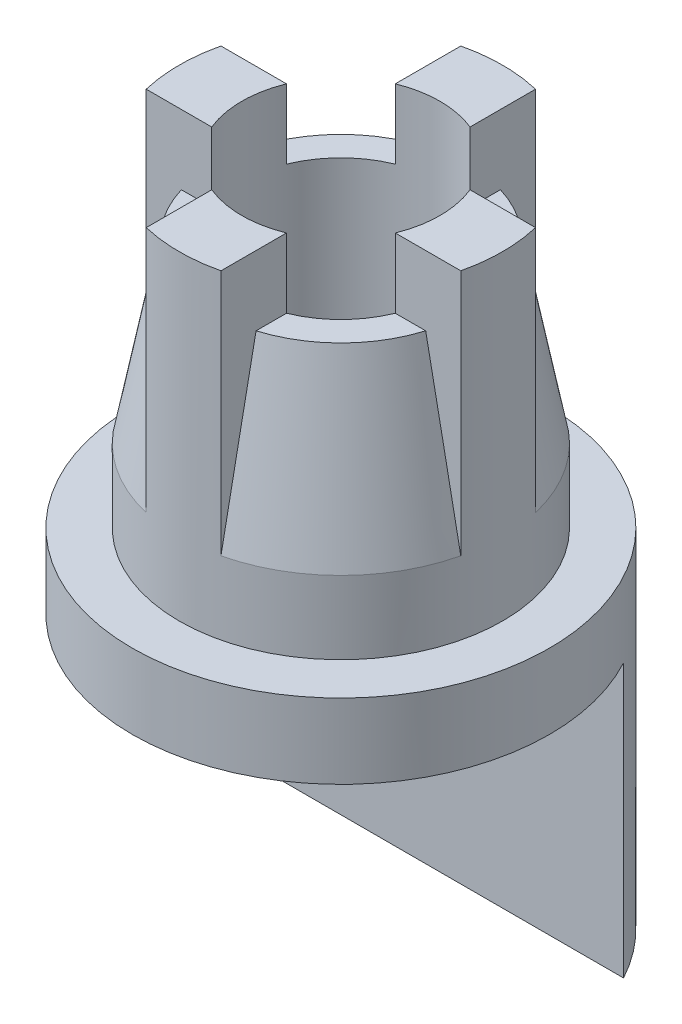
ISO-10303-21;
HEADER;
FILE_DESCRIPTION(('STEP AP214'),'2;1');
FILE_NAME('part.step','',(''),(''),'','','');
FILE_SCHEMA(('AUTOMOTIVE_DESIGN { 1 0 10303 214 1 1 1 1 }'));
ENDSEC;
DATA;
#1=APPLICATION_CONTEXT('core data for automotive mechanical design processes');
#2=APPLICATION_PROTOCOL_DEFINITION('international standard','automotive_design',2000,#1);
#3=PRODUCT_CONTEXT('',#1,'mechanical');
#4=PRODUCT('Part','Part','',(#3));
#5=PRODUCT_RELATED_PRODUCT_CATEGORY('part','',(#4));
#6=PRODUCT_DEFINITION_FORMATION('','',#4);
#7=PRODUCT_DEFINITION_CONTEXT('part definition',#1,'design');
#8=PRODUCT_DEFINITION('design','',#6,#7);
#9=PRODUCT_DEFINITION_SHAPE('','',#8);
#10=(LENGTH_UNIT() NAMED_UNIT(*) SI_UNIT(.MILLI.,.METRE.));
#11=(NAMED_UNIT(*) PLANE_ANGLE_UNIT() SI_UNIT($,.RADIAN.));
#12=(NAMED_UNIT(*) SI_UNIT($,.STERADIAN.) SOLID_ANGLE_UNIT());
#13=UNCERTAINTY_MEASURE_WITH_UNIT(LENGTH_MEASURE(1.E-05),#10,'distance_accuracy_value','');
#14=(GEOMETRIC_REPRESENTATION_CONTEXT(3) GLOBAL_UNCERTAINTY_ASSIGNED_CONTEXT((#13)) GLOBAL_UNIT_ASSIGNED_CONTEXT((#10,
#11,#12)) REPRESENTATION_CONTEXT('',''));
#15=CARTESIAN_POINT('',(0.,0.,0.));
#16=DIRECTION('',(0.,0.,1.));
#17=DIRECTION('',(1.,0.,0.));
#18=AXIS2_PLACEMENT_3D('',#15,#16,#17);
#19=CARTESIAN_POINT('',(0.,9.35,0.));
#20=DIRECTION('',(0.,1.,0.));
#21=DIRECTION('',(0.,0.,1.));
#22=AXIS2_PLACEMENT_3D('',#19,#20,#21);
#23=PLANE('',#22);
#24=CARTESIAN_POINT('',(0.,9.35,0.));
#25=DIRECTION('',(0.,1.,0.));
#26=DIRECTION('',(0.,0.,1.));
#27=AXIS2_PLACEMENT_3D('',#24,#25,#26);
#28=CIRCLE('',#27,2.85);
#29=CARTESIAN_POINT('',(-2.63948385105876,9.35,1.075));
#30=VERTEX_POINT('',#29);
#31=CARTESIAN_POINT('',(-1.075,9.35,2.63948385105876));
#32=VERTEX_POINT('',#31);
#33=EDGE_CURVE('E375',#30,#32,#28,.T.);
#34=ORIENTED_EDGE('',*,*,#33,.F.);
#35=DIRECTION('',(-1.,0.,0.));
#36=VECTOR('',#35,1.);
#37=CARTESIAN_POINT('',(0.,9.35,1.075));
#38=LINE('',#37,#36);
#39=CARTESIAN_POINT('',(-3.51425667816112,9.35,1.075));
#40=VERTEX_POINT('',#39);
#41=EDGE_CURVE('E587',#30,#40,#38,.T.);
#42=ORIENTED_EDGE('',*,*,#41,.T.);
#43=CARTESIAN_POINT('',(0.,9.35,0.));
#44=DIRECTION('',(0.,1.,0.));
#45=DIRECTION('',(0.,0.,1.));
#46=AXIS2_PLACEMENT_3D('',#43,#44,#45);
#47=CIRCLE('',#46,3.67500000000001);
#48=CARTESIAN_POINT('',(-1.075,9.35,3.51425667816112));
#49=VERTEX_POINT('',#48);
#50=EDGE_CURVE('E77',#40,#49,#47,.T.);
#51=ORIENTED_EDGE('',*,*,#50,.T.);
#52=DIRECTION('',(0.,0.,-1.));
#53=VECTOR('',#52,1.);
#54=CARTESIAN_POINT('',(-1.075,9.35,0.));
#55=LINE('',#54,#53);
#56=EDGE_CURVE('E275',#49,#32,#55,.T.);
#57=ORIENTED_EDGE('',*,*,#56,.T.);
#58=EDGE_LOOP('',(#34,#42,#51,#57));
#59=FACE_BOUND('',#58,.T.);
#60=ADVANCED_FACE('F46',(#59),#23,.T.);
#61=CARTESIAN_POINT('',(-1.075,9.35,-3.51425667816112));
#62=VERTEX_POINT('',#61);
#63=CARTESIAN_POINT('',(-3.51425667816112,9.35,-1.075));
#64=VERTEX_POINT('',#63);
#65=EDGE_CURVE('E354',#62,#64,#47,.T.);
#66=ORIENTED_EDGE('',*,*,#65,.T.);
#67=DIRECTION('',(1.,0.,0.));
#68=VECTOR('',#67,1.);
#69=CARTESIAN_POINT('',(0.,9.35,-1.075));
#70=LINE('',#69,#68);
#71=CARTESIAN_POINT('',(-2.63948385105876,9.35,-1.075));
#72=VERTEX_POINT('',#71);
#73=EDGE_CURVE('E69',#64,#72,#70,.T.);
#74=ORIENTED_EDGE('',*,*,#73,.T.);
#75=CARTESIAN_POINT('',(-1.075,9.35,-2.63948385105876));
#76=VERTEX_POINT('',#75);
#77=EDGE_CURVE('E364',#76,#72,#28,.T.);
#78=ORIENTED_EDGE('',*,*,#77,.F.);
#79=DIRECTION('',(0.,0.,-1.));
#80=VECTOR('',#79,1.);
#81=CARTESIAN_POINT('',(-1.075,9.35,0.));
#82=LINE('',#81,#80);
#83=EDGE_CURVE('E401',#76,#62,#82,.T.);
#84=ORIENTED_EDGE('',*,*,#83,.T.);
#85=EDGE_LOOP('',(#66,#74,#78,#84));
#86=FACE_BOUND('',#85,.T.);
#87=ADVANCED_FACE('F482',(#86),#23,.T.);
#88=CARTESIAN_POINT('',(0.,9.35,0.));
#89=DIRECTION('',(0.,-1.,0.));
#90=DIRECTION('',(0.,0.,-1.));
#91=AXIS2_PLACEMENT_3D('',#88,#89,#90);
#92=CONICAL_SURFACE('',#91,3.67500000000001,0.188897180877619);
#93=ORIENTED_EDGE('',*,*,#50,.F.);
#94=CARTESIAN_POINT('',(-2.40631870289933,14.7872511922928,1.075));
#95=CARTESIAN_POINT('',(-2.48209737417026,14.4252786578981,1.075));
#96=CARTESIAN_POINT('',(-2.55733243702377,14.0631929565488,1.075));
#97=CARTESIAN_POINT('',(-2.70692171139468,13.3388404007968,1.075));
#98=CARTESIAN_POINT('',(-2.78127592487787,12.9765735468001,1.075));
#99=CARTESIAN_POINT('',(-3.00332626033005,11.8895718934245,1.075));
#100=CARTESIAN_POINT('',(-3.15001117790777,11.1646307152761,1.075));
#101=CARTESIAN_POINT('',(-3.49050671102614,9.47137304827682,1.075));
#102=CARTESIAN_POINT('',(-3.68363485391252,8.50291962230982,1.075));
#103=CARTESIAN_POINT('',(-4.06797267762404,6.56563143798538,1.075));
#104=CARTESIAN_POINT('',(-4.25918235580213,5.59679667910371,1.075));
#105=CARTESIAN_POINT('',(-4.64033193204531,3.65885685019328,1.075));
#106=CARTESIAN_POINT('',(-4.83027180378933,2.68975177499239,1.075));
#107=CARTESIAN_POINT('',(-5.20923267535355,0.751365541388782,1.075));
#108=CARTESIAN_POINT('',(-5.39825367847481,-0.217915616368351,1.075));
#109=CARTESIAN_POINT('',(-5.58699337769868,-1.18725119229288,1.075));
#110=B_SPLINE_CURVE_WITH_KNOTS('',3,(#94,#95,#96,#97,#98,#99,#100,#101,#102,#103,#104,#105,#106,
#107,#108,#109),.UNSPECIFIED.,.F.,.F.,(4,2,2,2,2,2,2,4),(0.,1.10945741467031,2.21891235290055,
4.43780602733268,7.40037016501744,10.3629383898143,13.3255678347001,16.2881866284198),.UNSPECIFIED.);
#111=CARTESIAN_POINT('',(-4.52403304585632,4.24999999999993,1.075));
#112=VERTEX_POINT('',#111);
#113=EDGE_CURVE('E549',#40,#112,#110,.T.);
#114=ORIENTED_EDGE('',*,*,#113,.T.);
#115=CARTESIAN_POINT('',(0.,4.24999999999994,0.));
#116=DIRECTION('',(0.,1.,0.));
#117=DIRECTION('',(0.,0.,1.));
#118=AXIS2_PLACEMENT_3D('',#115,#116,#117);
#119=CIRCLE('',#118,4.65);
#120=CARTESIAN_POINT('',(-1.075,4.24999999999993,4.52403304585632));
#121=VERTEX_POINT('',#120);
#122=EDGE_CURVE('E469',#121,#112,#119,.F.);
#123=ORIENTED_EDGE('',*,*,#122,.F.);
#124=CARTESIAN_POINT('',(-1.075,-1.18725119229288,5.58699337769868));
#125=CARTESIAN_POINT('',(-1.075,-0.403621882947202,5.43442385550207));
#126=CARTESIAN_POINT('',(-1.075,0.379969279387494,5.28165772953076));
#127=CARTESIAN_POINT('',(-1.075,1.94704253826383,4.97556542208399));
#128=CARTESIAN_POINT('',(-1.075,2.73052463475852,4.82223924036825));
#129=CARTESIAN_POINT('',(-1.075,4.29733651245793,4.51486202770321));
#130=CARTESIAN_POINT('',(-1.075,5.0806662954463,4.36081100585016));
#131=CARTESIAN_POINT('',(-1.075,6.64713043406135,4.05171660477836));
#132=CARTESIAN_POINT('',(-1.075,7.43026478964085,3.89667322532024));
#133=CARTESIAN_POINT('',(-1.075,8.7615250545168,3.6318664029723));
#134=CARTESIAN_POINT('',(-1.075,9.30972244758589,3.52246250699375));
#135=CARTESIAN_POINT('',(-1.075,10.4059335725167,3.30274149511872));
#136=CARTESIAN_POINT('',(-1.075,10.9539473046134,3.19242438039571));
#137=CARTESIAN_POINT('',(-1.075,12.0497305828684,2.97055676297305));
#138=CARTESIAN_POINT('',(-1.075,12.597500126805,2.85900624928087));
#139=CARTESIAN_POINT('',(-1.075,13.4188878914701,2.69037591152323));
#140=CARTESIAN_POINT('',(-1.075,13.69263995527,2.63394825269071));
#141=CARTESIAN_POINT('',(-1.075,14.2400337566187,2.52055884226597));
#142=CARTESIAN_POINT('',(-1.075,14.513675494035,2.46359709003458));
#143=CARTESIAN_POINT('',(-1.075,14.7872511922927,2.40631870289935));
#144=B_SPLINE_CURVE_WITH_KNOTS('',3,(#124,#125,#126,#127,#128,#129,#130,#131,#132,#133,#134,
#135,#136,#137,#138,#139,#140,#141,#142,#143),.UNSPECIFIED.,.F.,.F.,(4,2,2,2,2,2,2,2,2,4),(0.,
2.39503068964986,4.79006240692704,7.1850641478624,9.58006646649337,11.2570889437261,
12.9341092663499,14.6111445473101,15.4496656657755,16.2881877878652),.UNSPECIFIED.);
#145=EDGE_CURVE('E550',#121,#49,#144,.T.);
#146=ORIENTED_EDGE('',*,*,#145,.T.);
#147=EDGE_LOOP('',(#93,#114,#123,#146));
#148=FACE_BOUND('',#147,.T.);
#149=ADVANCED_FACE('F528',(#148),#92,.T.);
#150=CARTESIAN_POINT('',(-4.52403304585632,4.24999999999993,-1.075));
#151=VERTEX_POINT('',#150);
#152=CARTESIAN_POINT('',(-1.075,4.24999999999993,-4.52403304585632));
#153=VERTEX_POINT('',#152);
#154=EDGE_CURVE('E353',#151,#153,#119,.F.);
#155=ORIENTED_EDGE('',*,*,#154,.F.);
#156=CARTESIAN_POINT('',(-5.58699337769868,-1.18725119229289,-1.075));
#157=CARTESIAN_POINT('',(-5.43442385550207,-0.403621882947206,-1.075));
#158=CARTESIAN_POINT('',(-5.28165772953076,0.379969279387491,-1.075));
#159=CARTESIAN_POINT('',(-4.97556542208399,1.94704253826382,-1.075));
#160=CARTESIAN_POINT('',(-4.82223924036825,2.73052463475852,-1.075));
#161=CARTESIAN_POINT('',(-4.51486202770321,4.29733651245793,-1.075));
#162=CARTESIAN_POINT('',(-4.36081100585017,5.0806662954463,-1.075));
#163=CARTESIAN_POINT('',(-4.05171660477836,6.64713043406135,-1.075));
#164=CARTESIAN_POINT('',(-3.89667322532024,7.43026478964085,-1.075));
#165=CARTESIAN_POINT('',(-3.6318664029723,8.76152505451681,-1.075));
#166=CARTESIAN_POINT('',(-3.52246250699375,9.30972244758591,-1.075));
#167=CARTESIAN_POINT('',(-3.30274149511872,10.4059335725167,-1.075));
#168=CARTESIAN_POINT('',(-3.1924243803957,10.9539473046134,-1.075));
#169=CARTESIAN_POINT('',(-2.97055676297304,12.0497305828684,-1.075));
#170=CARTESIAN_POINT('',(-2.85900624928086,12.597500126805,-1.075));
#171=CARTESIAN_POINT('',(-2.69037591152322,13.4188878914702,-1.075));
#172=CARTESIAN_POINT('',(-2.63394825269069,13.6926399552701,-1.075));
#173=CARTESIAN_POINT('',(-2.52055884226595,14.2400337566188,-1.075));
#174=CARTESIAN_POINT('',(-2.46359709003456,14.5136754940351,-1.075));
#175=CARTESIAN_POINT('',(-2.40631870289933,14.7872511922928,-1.075));
#176=B_SPLINE_CURVE_WITH_KNOTS('',3,(#156,#157,#158,#159,#160,#161,#162,#163,#164,#165,#166,
#167,#168,#169,#170,#171,#172,#173,#174,#175),.UNSPECIFIED.,.F.,.F.,(4,2,2,2,2,2,2,2,2,4),(0.,
2.39503068964987,4.79006240692704,7.1850641478624,9.58006646649337,11.2570889437261,
12.93410926635,14.6111445473102,15.4496656657756,16.2881877878653),.UNSPECIFIED.);
#177=EDGE_CURVE('E222',#151,#64,#176,.T.);
#178=ORIENTED_EDGE('',*,*,#177,.T.);
#179=ORIENTED_EDGE('',*,*,#65,.F.);
#180=CARTESIAN_POINT('',(-1.075,14.7872511922928,-2.40631870289933));
#181=CARTESIAN_POINT('',(-1.075,14.4252786578981,-2.48209737417026));
#182=CARTESIAN_POINT('',(-1.075,14.0631929565488,-2.55733243702377));
#183=CARTESIAN_POINT('',(-1.075,13.3388404007968,-2.70692171139468));
#184=CARTESIAN_POINT('',(-1.075,12.9765735468001,-2.78127592487787));
#185=CARTESIAN_POINT('',(-1.075,11.8895718934245,-3.00332626033005));
#186=CARTESIAN_POINT('',(-1.075,11.1646307152761,-3.15001117790777));
#187=CARTESIAN_POINT('',(-1.075,9.47137304827682,-3.49050671102614));
#188=CARTESIAN_POINT('',(-1.075,8.50291962230982,-3.68363485391252));
#189=CARTESIAN_POINT('',(-1.075,6.56563143798538,-4.06797267762404));
#190=CARTESIAN_POINT('',(-1.075,5.59679667910371,-4.25918235580213));
#191=CARTESIAN_POINT('',(-1.075,3.65885685019328,-4.64033193204531));
#192=CARTESIAN_POINT('',(-1.075,2.68975177499239,-4.83027180378933));
#193=CARTESIAN_POINT('',(-1.075,0.751365541388782,-5.20923267535355));
#194=CARTESIAN_POINT('',(-1.075,-0.217915616368352,-5.3982536784748));
#195=CARTESIAN_POINT('',(-1.075,-1.18725119229288,-5.58699337769868));
#196=B_SPLINE_CURVE_WITH_KNOTS('',3,(#180,#181,#182,#183,#184,#185,#186,#187,#188,#189,#190,
#191,#192,#193,#194,#195),.UNSPECIFIED.,.F.,.F.,(4,2,2,2,2,2,2,4),(0.,1.10945741467031,
2.21891235290055,4.43780602733268,7.40037016501744,10.3629383898143,13.3255678347001,
16.2881866284198),.UNSPECIFIED.);
#197=EDGE_CURVE('E12',#62,#153,#196,.T.);
#198=ORIENTED_EDGE('',*,*,#197,.T.);
#199=EDGE_LOOP('',(#155,#178,#179,#198));
#200=FACE_BOUND('',#199,.T.);
#201=ADVANCED_FACE('F480',(#200),#92,.T.);
#202=CARTESIAN_POINT('',(1.075,9.35,2.63948385105876));
#203=VERTEX_POINT('',#202);
#204=CARTESIAN_POINT('',(2.63948385105876,9.35,1.075));
#205=VERTEX_POINT('',#204);
#206=EDGE_CURVE('E457',#203,#205,#28,.T.);
#207=ORIENTED_EDGE('',*,*,#206,.F.);
#208=DIRECTION('',(0.,0.,1.));
#209=VECTOR('',#208,1.);
#210=CARTESIAN_POINT('',(1.075,9.35,0.));
#211=LINE('',#210,#209);
#212=CARTESIAN_POINT('',(1.075,9.35,3.51425667816112));
#213=VERTEX_POINT('',#212);
#214=EDGE_CURVE('E274',#203,#213,#211,.T.);
#215=ORIENTED_EDGE('',*,*,#214,.T.);
#216=CARTESIAN_POINT('',(3.51425667816112,9.35,1.075));
#217=VERTEX_POINT('',#216);
#218=EDGE_CURVE('E459',#213,#217,#47,.T.);
#219=ORIENTED_EDGE('',*,*,#218,.T.);
#220=DIRECTION('',(-1.,0.,0.));
#221=VECTOR('',#220,1.);
#222=CARTESIAN_POINT('',(0.,9.35,1.075));
#223=LINE('',#222,#221);
#224=EDGE_CURVE('E317',#217,#205,#223,.T.);
#225=ORIENTED_EDGE('',*,*,#224,.T.);
#226=EDGE_LOOP('',(#207,#215,#219,#225));
#227=FACE_BOUND('',#226,.T.);
#228=ADVANCED_FACE('F456',(#227),#23,.T.);
#229=ORIENTED_EDGE('',*,*,#218,.F.);
#230=CARTESIAN_POINT('',(1.075,14.7872511922928,2.40631870289933));
#231=CARTESIAN_POINT('',(1.075,14.4252786578981,2.48209737417026));
#232=CARTESIAN_POINT('',(1.075,14.0631929565488,2.55733243702377));
#233=CARTESIAN_POINT('',(1.075,13.3388404007968,2.70692171139468));
#234=CARTESIAN_POINT('',(1.075,12.9765735468001,2.78127592487787));
#235=CARTESIAN_POINT('',(1.075,11.8895718934245,3.00332626033005));
#236=CARTESIAN_POINT('',(1.075,11.1646307152761,3.15001117790777));
#237=CARTESIAN_POINT('',(1.075,9.47137304827683,3.49050671102614));
#238=CARTESIAN_POINT('',(1.075,8.50291962230982,3.68363485391252));
#239=CARTESIAN_POINT('',(1.075,6.56563143798538,4.06797267762404));
#240=CARTESIAN_POINT('',(1.075,5.59679667910371,4.25918235580213));
#241=CARTESIAN_POINT('',(1.075,3.65885685019328,4.64033193204531));
#242=CARTESIAN_POINT('',(1.075,2.68975177499239,4.83027180378933));
#243=CARTESIAN_POINT('',(1.075,0.751365541388784,5.20923267535355));
#244=CARTESIAN_POINT('',(1.075,-0.217915616368349,5.3982536784748));
#245=CARTESIAN_POINT('',(1.075,-1.18725119229288,5.58699337769868));
#246=B_SPLINE_CURVE_WITH_KNOTS('',3,(#230,#231,#232,#233,#234,#235,#236,#237,#238,#239,#240,
#241,#242,#243,#244,#245),.UNSPECIFIED.,.F.,.F.,(4,2,2,2,2,2,2,4),(0.,1.10945741467031,
2.21891235290055,4.43780602733268,7.40037016501744,10.3629383898143,13.3255678347001,
16.2881866284198),.UNSPECIFIED.);
#247=CARTESIAN_POINT('',(1.075,4.24999999999993,4.52403304585632));
#248=VERTEX_POINT('',#247);
#249=EDGE_CURVE('E265',#213,#248,#246,.T.);
#250=ORIENTED_EDGE('',*,*,#249,.T.);
#251=CARTESIAN_POINT('',(4.52403304585632,4.24999999999993,1.075));
#252=VERTEX_POINT('',#251);
#253=EDGE_CURVE('E352',#252,#248,#119,.F.);
#254=ORIENTED_EDGE('',*,*,#253,.F.);
#255=CARTESIAN_POINT('',(5.58699337769868,-1.18725119229288,1.075));
#256=CARTESIAN_POINT('',(5.43442385550207,-0.403621882947203,1.075));
#257=CARTESIAN_POINT('',(5.28165772953076,0.379969279387494,1.075));
#258=CARTESIAN_POINT('',(4.97556542208399,1.94704253826383,1.075));
#259=CARTESIAN_POINT('',(4.82223924036825,2.73052463475852,1.075));
#260=CARTESIAN_POINT('',(4.51486202770321,4.29733651245793,1.075));
#261=CARTESIAN_POINT('',(4.36081100585016,5.0806662954463,1.075));
#262=CARTESIAN_POINT('',(4.05171660477836,6.64713043406135,1.075));
#263=CARTESIAN_POINT('',(3.89667322532024,7.43026478964085,1.075));
#264=CARTESIAN_POINT('',(3.6318664029723,8.76152505451681,1.075));
#265=CARTESIAN_POINT('',(3.52246250699375,9.30972244758591,1.075));
#266=CARTESIAN_POINT('',(3.30274149511872,10.4059335725167,1.075));
#267=CARTESIAN_POINT('',(3.1924243803957,10.9539473046134,1.075));
#268=CARTESIAN_POINT('',(2.97055676297304,12.0497305828684,1.075));
#269=CARTESIAN_POINT('',(2.85900624928086,12.597500126805,1.075));
#270=CARTESIAN_POINT('',(2.69037591152322,13.4188878914702,1.075));
#271=CARTESIAN_POINT('',(2.63394825269069,13.6926399552701,1.075));
#272=CARTESIAN_POINT('',(2.52055884226595,14.2400337566188,1.075));
#273=CARTESIAN_POINT('',(2.46359709003456,14.5136754940351,1.075));
#274=CARTESIAN_POINT('',(2.40631870289933,14.7872511922928,1.075));
#275=B_SPLINE_CURVE_WITH_KNOTS('',3,(#255,#256,#257,#258,#259,#260,#261,#262,#263,#264,#265,
#266,#267,#268,#269,#270,#271,#272,#273,#274),.UNSPECIFIED.,.F.,.F.,(4,2,2,2,2,2,2,2,2,4),(0.,
2.39503068964987,4.79006240692704,7.1850641478624,9.58006646649337,11.2570889437261,
12.93410926635,14.6111445473102,15.4496656657756,16.2881877878653),.UNSPECIFIED.);
#276=EDGE_CURVE('E308',#252,#217,#275,.T.);
#277=ORIENTED_EDGE('',*,*,#276,.T.);
#278=EDGE_LOOP('',(#229,#250,#254,#277));
#279=FACE_BOUND('',#278,.T.);
#280=ADVANCED_FACE('F465',(#279),#92,.T.);
#281=CARTESIAN_POINT('',(2.63948385105876,9.35,-1.075));
#282=VERTEX_POINT('',#281);
#283=CARTESIAN_POINT('',(1.075,9.35,-2.63948385105876));
#284=VERTEX_POINT('',#283);
#285=EDGE_CURVE('E376',#282,#284,#28,.T.);
#286=ORIENTED_EDGE('',*,*,#285,.F.);
#287=DIRECTION('',(1.,0.,0.));
#288=VECTOR('',#287,1.);
#289=CARTESIAN_POINT('',(0.,9.35,-1.075));
#290=LINE('',#289,#288);
#291=CARTESIAN_POINT('',(3.51425667816112,9.35,-1.075));
#292=VERTEX_POINT('',#291);
#293=EDGE_CURVE('E438',#282,#292,#290,.T.);
#294=ORIENTED_EDGE('',*,*,#293,.T.);
#295=CARTESIAN_POINT('',(1.075,9.35,-3.51425667816112));
#296=VERTEX_POINT('',#295);
#297=EDGE_CURVE('E358',#292,#296,#47,.T.);
#298=ORIENTED_EDGE('',*,*,#297,.T.);
#299=DIRECTION('',(0.,0.,1.));
#300=VECTOR('',#299,1.);
#301=CARTESIAN_POINT('',(1.075,9.35,0.));
#302=LINE('',#301,#300);
#303=EDGE_CURVE('E405',#296,#284,#302,.T.);
#304=ORIENTED_EDGE('',*,*,#303,.T.);
#305=EDGE_LOOP('',(#286,#294,#298,#304));
#306=FACE_BOUND('',#305,.T.);
#307=ADVANCED_FACE('F495',(#306),#23,.T.);
#308=ORIENTED_EDGE('',*,*,#297,.F.);
#309=CARTESIAN_POINT('',(2.40631870289935,14.7872511922927,-1.075));
#310=CARTESIAN_POINT('',(2.48209737417028,14.4252786578979,-1.075));
#311=CARTESIAN_POINT('',(2.55733243702379,14.0631929565487,-1.075));
#312=CARTESIAN_POINT('',(2.7069217113947,13.3388404007967,-1.075));
#313=CARTESIAN_POINT('',(2.78127592487789,12.9765735468,-1.075));
#314=CARTESIAN_POINT('',(3.00332626033008,11.8895718934244,-1.075));
#315=CARTESIAN_POINT('',(3.15001117790779,11.164630715276,-1.075));
#316=CARTESIAN_POINT('',(3.49050671102616,9.47137304827669,-1.075));
#317=CARTESIAN_POINT('',(3.68363485391254,8.5029196223097,-1.075));
#318=CARTESIAN_POINT('',(4.06797267762406,6.56563143798528,-1.075));
#319=CARTESIAN_POINT('',(4.25918235580215,5.59679667910362,-1.075));
#320=CARTESIAN_POINT('',(4.64033193204532,3.65885685019322,-1.075));
#321=CARTESIAN_POINT('',(4.83027180378934,2.68975177499234,-1.075));
#322=CARTESIAN_POINT('',(5.20923267535356,0.751365541388756,-1.075));
#323=CARTESIAN_POINT('',(5.39825367847481,-0.217915616368367,-1.075));
#324=CARTESIAN_POINT('',(5.58699337769868,-1.18725119229289,-1.075));
#325=B_SPLINE_CURVE_WITH_KNOTS('',3,(#309,#310,#311,#312,#313,#314,#315,#316,#317,#318,#319,
#320,#321,#322,#323,#324),.UNSPECIFIED.,.F.,.F.,(4,2,2,2,2,2,2,4),(0.,1.10945741467032,
2.21891235290057,4.43780602733272,7.40037016501744,10.3629383898142,13.3255678347,
16.2881866284197),.UNSPECIFIED.);
#326=CARTESIAN_POINT('',(4.52403304585632,4.24999999999993,-1.075));
#327=VERTEX_POINT('',#326);
#328=EDGE_CURVE('E441',#292,#327,#325,.T.);
#329=ORIENTED_EDGE('',*,*,#328,.T.);
#330=CARTESIAN_POINT('',(1.075,4.24999999999993,-4.52403304585632));
#331=VERTEX_POINT('',#330);
#332=EDGE_CURVE('E348',#331,#327,#119,.F.);
#333=ORIENTED_EDGE('',*,*,#332,.F.);
#334=CARTESIAN_POINT('',(1.075,-1.18725119229288,-5.58699337769868));
#335=CARTESIAN_POINT('',(1.075,-0.403621882947203,-5.43442385550207));
#336=CARTESIAN_POINT('',(1.075,0.379969279387494,-5.28165772953076));
#337=CARTESIAN_POINT('',(1.075,1.94704253826383,-4.97556542208399));
#338=CARTESIAN_POINT('',(1.075,2.73052463475852,-4.82223924036825));
#339=CARTESIAN_POINT('',(1.075,4.29733651245793,-4.51486202770321));
#340=CARTESIAN_POINT('',(1.075,5.0806662954463,-4.36081100585016));
#341=CARTESIAN_POINT('',(1.075,6.64713043406135,-4.05171660477836));
#342=CARTESIAN_POINT('',(1.075,7.43026478964085,-3.89667322532024));
#343=CARTESIAN_POINT('',(1.075,8.76152505451681,-3.6318664029723));
#344=CARTESIAN_POINT('',(1.075,9.30972244758591,-3.52246250699375));
#345=CARTESIAN_POINT('',(1.075,10.4059335725167,-3.30274149511872));
#346=CARTESIAN_POINT('',(1.075,10.9539473046134,-3.1924243803957));
#347=CARTESIAN_POINT('',(1.075,12.0497305828684,-2.97055676297304));
#348=CARTESIAN_POINT('',(1.075,12.597500126805,-2.85900624928086));
#349=CARTESIAN_POINT('',(1.075,13.4188878914702,-2.69037591152322));
#350=CARTESIAN_POINT('',(1.075,13.6926399552701,-2.63394825269069));
#351=CARTESIAN_POINT('',(1.075,14.2400337566188,-2.52055884226595));
#352=CARTESIAN_POINT('',(1.075,14.5136754940351,-2.46359709003456));
#353=CARTESIAN_POINT('',(1.075,14.7872511922928,-2.40631870289933));
#354=B_SPLINE_CURVE_WITH_KNOTS('',3,(#334,#335,#336,#337,#338,#339,#340,#341,#342,#343,#344,
#345,#346,#347,#348,#349,#350,#351,#352,#353),.UNSPECIFIED.,.F.,.F.,(4,2,2,2,2,2,2,2,2,4),(0.,
2.39503068964987,4.79006240692704,7.1850641478624,9.58006646649337,11.2570889437261,
12.93410926635,14.6111445473102,15.4496656657756,16.2881877878653),.UNSPECIFIED.);
#355=EDGE_CURVE('E62',#331,#296,#354,.T.);
#356=ORIENTED_EDGE('',*,*,#355,.T.);
#357=EDGE_LOOP('',(#308,#329,#333,#356));
#358=FACE_BOUND('',#357,.T.);
#359=ADVANCED_FACE('F49',(#358),#92,.T.);
#360=CARTESIAN_POINT('',(0.,2.15,0.));
#361=DIRECTION('',(0.,-1.,0.));
#362=DIRECTION('',(0.,0.,-1.));
#363=AXIS2_PLACEMENT_3D('',#360,#361,#362);
#364=CYLINDRICAL_SURFACE('',#363,6.);
#365=DIRECTION('',(0.,1.,0.));
#366=VECTOR('',#365,1.);
#367=CARTESIAN_POINT('',(-5.27991477203941,-7.85,-2.85));
#368=LINE('',#367,#366);
#369=CARTESIAN_POINT('',(-5.27991477203941,-7.85,-2.85));
#370=VERTEX_POINT('',#369);
#371=CARTESIAN_POINT('',(-5.27991477203941,0.,-2.85));
#372=VERTEX_POINT('',#371);
#373=EDGE_CURVE('E387',#370,#372,#368,.T.);
#374=ORIENTED_EDGE('',*,*,#373,.T.);
#375=CARTESIAN_POINT('',(0.,0.,0.));
#376=DIRECTION('',(0.,1.,0.));
#377=DIRECTION('',(0.,0.,1.));
#378=AXIS2_PLACEMENT_3D('',#375,#376,#377);
#379=CIRCLE('',#378,6.);
#380=CARTESIAN_POINT('',(5.27991477203941,0.,-2.85));
#381=VERTEX_POINT('',#380);
#382=EDGE_CURVE('E359',#372,#381,#379,.T.);
#383=ORIENTED_EDGE('',*,*,#382,.T.);
#384=DIRECTION('',(0.,1.,0.));
#385=VECTOR('',#384,1.);
#386=CARTESIAN_POINT('',(5.27991477203941,-7.85,-2.85));
#387=LINE('',#386,#385);
#388=CARTESIAN_POINT('',(5.27991477203941,-7.85,-2.85));
#389=VERTEX_POINT('',#388);
#390=EDGE_CURVE('E386',#389,#381,#387,.T.);
#391=ORIENTED_EDGE('',*,*,#390,.F.);
#392=CARTESIAN_POINT('',(0.,-7.85,0.));
#393=DIRECTION('',(0.,1.,0.));
#394=DIRECTION('',(0.,0.,1.));
#395=AXIS2_PLACEMENT_3D('',#392,#393,#394);
#396=CIRCLE('',#395,6.);
#397=EDGE_CURVE('E397',#389,#370,#396,.T.);
#398=ORIENTED_EDGE('',*,*,#397,.T.);
#399=EDGE_LOOP('',(#374,#383,#391,#398));
#400=FACE_BOUND('',#399,.T.);
#401=CARTESIAN_POINT('',(0.,2.15,0.));
#402=DIRECTION('',(0.,1.,0.));
#403=DIRECTION('',(0.,0.,1.));
#404=AXIS2_PLACEMENT_3D('',#401,#402,#403);
#405=CIRCLE('',#404,6.);
#406=CARTESIAN_POINT('',(0.,2.15,6.));
#407=VERTEX_POINT('',#406);
#408=EDGE_CURVE('E363',#407,#407,#405,.T.);
#409=ORIENTED_EDGE('',*,*,#408,.F.);
#410=EDGE_LOOP('',(#409));
#411=FACE_BOUND('',#410,.T.);
#412=ADVANCED_FACE('F511',(#400,#411),#364,.T.);
#413=CARTESIAN_POINT('',(0.,2.15,0.));
#414=DIRECTION('',(0.,1.,0.));
#415=DIRECTION('',(0.,0.,1.));
#416=AXIS2_PLACEMENT_3D('',#413,#414,#415);
#417=PLANE('',#416);
#418=CARTESIAN_POINT('',(0.,2.15,0.));
#419=DIRECTION('',(0.,1.,0.));
#420=DIRECTION('',(0.,0.,1.));
#421=AXIS2_PLACEMENT_3D('',#418,#419,#420);
#422=CIRCLE('',#421,4.65);
#423=CARTESIAN_POINT('',(0.,2.15,4.65));
#424=VERTEX_POINT('',#423);
#425=EDGE_CURVE('E368',#424,#424,#422,.T.);
#426=ORIENTED_EDGE('',*,*,#425,.F.);
#427=EDGE_LOOP('',(#426));
#428=FACE_BOUND('',#427,.T.);
#429=ORIENTED_EDGE('',*,*,#408,.T.);
#430=EDGE_LOOP('',(#429));
#431=FACE_BOUND('',#430,.T.);
#432=ADVANCED_FACE('F738',(#428,#431),#417,.T.);
#433=CARTESIAN_POINT('',(0.,0.,0.));
#434=DIRECTION('',(0.,1.,0.));
#435=DIRECTION('',(0.,0.,1.));
#436=AXIS2_PLACEMENT_3D('',#433,#434,#435);
#437=PLANE('',#436);
#438=ORIENTED_EDGE('',*,*,#382,.F.);
#439=DIRECTION('',(1.,0.,0.));
#440=VECTOR('',#439,1.);
#441=CARTESIAN_POINT('',(0.,0.,-2.85));
#442=LINE('',#441,#440);
#443=CARTESIAN_POINT('',(0.,0.,-2.85));
#444=VERTEX_POINT('',#443);
#445=EDGE_CURVE('E381',#372,#444,#442,.T.);
#446=ORIENTED_EDGE('',*,*,#445,.T.);
#447=CARTESIAN_POINT('',(0.,0.,0.));
#448=DIRECTION('',(0.,1.,0.));
#449=DIRECTION('',(0.,0.,1.));
#450=AXIS2_PLACEMENT_3D('',#447,#448,#449);
#451=CIRCLE('',#450,2.85);
#452=EDGE_CURVE('E377',#444,#444,#451,.T.);
#453=ORIENTED_EDGE('',*,*,#452,.T.);
#454=EDGE_CURVE('E382',#444,#381,#442,.T.);
#455=ORIENTED_EDGE('',*,*,#454,.T.);
#456=EDGE_LOOP('',(#438,#446,#453,#455));
#457=FACE_BOUND('',#456,.T.);
#458=ADVANCED_FACE('F506',(#457),#437,.F.);
#459=CARTESIAN_POINT('',(0.,9.35,0.));
#460=DIRECTION('',(0.,-1.,0.));
#461=DIRECTION('',(0.,0.,-1.));
#462=AXIS2_PLACEMENT_3D('',#459,#460,#461);
#463=CYLINDRICAL_SURFACE('',#462,4.65);
#464=ORIENTED_EDGE('',*,*,#122,.T.);
#465=DIRECTION('',(0.,-1.,0.));
#466=VECTOR('',#465,1.);
#467=CARTESIAN_POINT('',(-4.52403304585632,11.35,1.075));
#468=LINE('',#467,#466);
#469=CARTESIAN_POINT('',(-4.52403304585632,11.35,1.075));
#470=VERTEX_POINT('',#469);
#471=EDGE_CURVE('E231',#470,#112,#468,.T.);
#472=ORIENTED_EDGE('',*,*,#471,.F.);
#473=CARTESIAN_POINT('',(0.,11.35,0.));
#474=DIRECTION('',(0.,1.,0.));
#475=DIRECTION('',(0.,0.,1.));
#476=AXIS2_PLACEMENT_3D('',#473,#474,#475);
#477=CIRCLE('',#476,4.65);
#478=CARTESIAN_POINT('',(-4.52403304585632,11.35,-1.075));
#479=VERTEX_POINT('',#478);
#480=EDGE_CURVE('E212',#479,#470,#477,.T.);
#481=ORIENTED_EDGE('',*,*,#480,.F.);
#482=DIRECTION('',(0.,-1.,0.));
#483=VECTOR('',#482,1.);
#484=CARTESIAN_POINT('',(-4.52403304585632,11.35,-1.075));
#485=LINE('',#484,#483);
#486=EDGE_CURVE('E218',#479,#151,#485,.T.);
#487=ORIENTED_EDGE('',*,*,#486,.T.);
#488=ORIENTED_EDGE('',*,*,#154,.T.);
#489=DIRECTION('',(0.,-1.,0.));
#490=VECTOR('',#489,1.);
#491=CARTESIAN_POINT('',(-1.075,11.35,-4.52403304585632));
#492=LINE('',#491,#490);
#493=CARTESIAN_POINT('',(-1.075,11.35,-4.52403304585632));
#494=VERTEX_POINT('',#493);
#495=EDGE_CURVE('E409',#494,#153,#492,.T.);
#496=ORIENTED_EDGE('',*,*,#495,.F.);
#497=CARTESIAN_POINT('',(0.,11.35,0.));
#498=DIRECTION('',(0.,1.,0.));
#499=DIRECTION('',(0.,0.,1.));
#500=AXIS2_PLACEMENT_3D('',#497,#498,#499);
#501=CIRCLE('',#500,4.65);
#502=CARTESIAN_POINT('',(1.075,11.35,-4.52403304585632));
#503=VERTEX_POINT('',#502);
#504=EDGE_CURVE('E434',#503,#494,#501,.T.);
#505=ORIENTED_EDGE('',*,*,#504,.F.);
#506=DIRECTION('',(0.,-1.,0.));
#507=VECTOR('',#506,1.);
#508=CARTESIAN_POINT('',(1.075,11.35,-4.52403304585632));
#509=LINE('',#508,#507);
#510=EDGE_CURVE('E421',#503,#331,#509,.T.);
#511=ORIENTED_EDGE('',*,*,#510,.T.);
#512=ORIENTED_EDGE('',*,*,#332,.T.);
#513=DIRECTION('',(0.,-1.,0.));
#514=VECTOR('',#513,1.);
#515=CARTESIAN_POINT('',(4.52403304585632,11.35,-1.075));
#516=LINE('',#515,#514);
#517=CARTESIAN_POINT('',(4.52403304585632,11.35,-1.075));
#518=VERTEX_POINT('',#517);
#519=EDGE_CURVE('E280',#518,#327,#516,.T.);
#520=ORIENTED_EDGE('',*,*,#519,.F.);
#521=CARTESIAN_POINT('',(0.,11.35,0.));
#522=DIRECTION('',(0.,1.,0.));
#523=DIRECTION('',(0.,0.,1.));
#524=AXIS2_PLACEMENT_3D('',#521,#522,#523);
#525=CIRCLE('',#524,4.65);
#526=CARTESIAN_POINT('',(4.52403304585632,11.35,1.075));
#527=VERTEX_POINT('',#526);
#528=EDGE_CURVE('E304',#527,#518,#525,.T.);
#529=ORIENTED_EDGE('',*,*,#528,.F.);
#530=DIRECTION('',(0.,-1.,0.));
#531=VECTOR('',#530,1.);
#532=CARTESIAN_POINT('',(4.52403304585632,11.35,1.075));
#533=LINE('',#532,#531);
#534=EDGE_CURVE('E291',#527,#252,#533,.T.);
#535=ORIENTED_EDGE('',*,*,#534,.T.);
#536=ORIENTED_EDGE('',*,*,#253,.T.);
#537=DIRECTION('',(0.,-1.,0.));
#538=VECTOR('',#537,1.);
#539=CARTESIAN_POINT('',(1.075,11.35,4.52403304585632));
#540=LINE('',#539,#538);
#541=CARTESIAN_POINT('',(1.075,11.35,4.52403304585632));
#542=VERTEX_POINT('',#541);
#543=EDGE_CURVE('E584',#542,#248,#540,.T.);
#544=ORIENTED_EDGE('',*,*,#543,.F.);
#545=CARTESIAN_POINT('',(0.,11.35,0.));
#546=DIRECTION('',(0.,1.,0.));
#547=DIRECTION('',(0.,0.,1.));
#548=AXIS2_PLACEMENT_3D('',#545,#546,#547);
#549=CIRCLE('',#548,4.65);
#550=CARTESIAN_POINT('',(-1.075,11.35,4.52403304585632));
#551=VERTEX_POINT('',#550);
#552=EDGE_CURVE('E554',#551,#542,#549,.T.);
#553=ORIENTED_EDGE('',*,*,#552,.F.);
#554=DIRECTION('',(0.,-1.,0.));
#555=VECTOR('',#554,1.);
#556=CARTESIAN_POINT('',(-1.075,11.35,4.52403304585632));
#557=LINE('',#556,#555);
#558=EDGE_CURVE('E573',#551,#121,#557,.T.);
#559=ORIENTED_EDGE('',*,*,#558,.T.);
#560=EDGE_LOOP('',(#464,#472,#481,#487,#488,#496,#505,#511,#512,#520,#529,#535,#536,#544,#553,#559));
#561=FACE_BOUND('',#560,.T.);
#562=ORIENTED_EDGE('',*,*,#425,.T.);
#563=EDGE_LOOP('',(#562));
#564=FACE_BOUND('',#563,.T.);
#565=ADVANCED_FACE('F229',(#561,#564),#463,.T.);
#566=CARTESIAN_POINT('',(0.,9.35,0.));
#567=DIRECTION('',(0.,-1.,0.));
#568=DIRECTION('',(0.,0.,-1.));
#569=AXIS2_PLACEMENT_3D('',#566,#567,#568);
#570=CYLINDRICAL_SURFACE('',#569,2.85);
#571=ORIENTED_EDGE('',*,*,#77,.T.);
#572=DIRECTION('',(0.,-1.,0.));
#573=VECTOR('',#572,1.);
#574=CARTESIAN_POINT('',(-2.63948385105876,11.35,-1.075));
#575=LINE('',#574,#573);
#576=CARTESIAN_POINT('',(-2.63948385105876,11.35,-1.075));
#577=VERTEX_POINT('',#576);
#578=EDGE_CURVE('E226',#577,#72,#575,.T.);
#579=ORIENTED_EDGE('',*,*,#578,.F.);
#580=CARTESIAN_POINT('',(0.,11.35,0.));
#581=DIRECTION('',(0.,-1.,0.));
#582=DIRECTION('',(0.,0.,1.));
#583=AXIS2_PLACEMENT_3D('',#580,#581,#582);
#584=CIRCLE('',#583,2.85);
#585=CARTESIAN_POINT('',(-2.63948385105876,11.35,1.075));
#586=VERTEX_POINT('',#585);
#587=EDGE_CURVE('E215',#586,#577,#584,.T.);
#588=ORIENTED_EDGE('',*,*,#587,.F.);
#589=DIRECTION('',(0.,-1.,0.));
#590=VECTOR('',#589,1.);
#591=CARTESIAN_POINT('',(-2.63948385105876,11.35,1.075));
#592=LINE('',#591,#590);
#593=EDGE_CURVE('E598',#586,#30,#592,.T.);
#594=ORIENTED_EDGE('',*,*,#593,.T.);
#595=ORIENTED_EDGE('',*,*,#33,.T.);
#596=DIRECTION('',(0.,-1.,0.));
#597=VECTOR('',#596,1.);
#598=CARTESIAN_POINT('',(-1.075,11.35,2.63948385105876));
#599=LINE('',#598,#597);
#600=CARTESIAN_POINT('',(-1.075,11.35,2.63948385105876));
#601=VERTEX_POINT('',#600);
#602=EDGE_CURVE('E576',#601,#32,#599,.T.);
#603=ORIENTED_EDGE('',*,*,#602,.F.);
#604=CARTESIAN_POINT('',(0.,11.35,0.));
#605=DIRECTION('',(0.,-1.,0.));
#606=DIRECTION('',(0.,0.,1.));
#607=AXIS2_PLACEMENT_3D('',#604,#605,#606);
#608=CIRCLE('',#607,2.85);
#609=CARTESIAN_POINT('',(1.075,11.35,2.63948385105876));
#610=VERTEX_POINT('',#609);
#611=EDGE_CURVE('E567',#610,#601,#608,.T.);
#612=ORIENTED_EDGE('',*,*,#611,.F.);
#613=DIRECTION('',(0.,-1.,0.));
#614=VECTOR('',#613,1.);
#615=CARTESIAN_POINT('',(1.075,11.35,2.63948385105876));
#616=LINE('',#615,#614);
#617=EDGE_CURVE('E580',#610,#203,#616,.T.);
#618=ORIENTED_EDGE('',*,*,#617,.T.);
#619=ORIENTED_EDGE('',*,*,#206,.T.);
#620=DIRECTION('',(0.,-1.,0.));
#621=VECTOR('',#620,1.);
#622=CARTESIAN_POINT('',(2.63948385105876,11.35,1.075));
#623=LINE('',#622,#621);
#624=CARTESIAN_POINT('',(2.63948385105876,11.35,1.075));
#625=VERTEX_POINT('',#624);
#626=EDGE_CURVE('E287',#625,#205,#623,.T.);
#627=ORIENTED_EDGE('',*,*,#626,.F.);
#628=CARTESIAN_POINT('',(0.,11.35,0.));
#629=DIRECTION('',(0.,-1.,0.));
#630=DIRECTION('',(0.,0.,1.));
#631=AXIS2_PLACEMENT_3D('',#628,#629,#630);
#632=CIRCLE('',#631,2.85);
#633=CARTESIAN_POINT('',(2.63948385105876,11.35,-1.075));
#634=VERTEX_POINT('',#633);
#635=EDGE_CURVE('E298',#634,#625,#632,.T.);
#636=ORIENTED_EDGE('',*,*,#635,.F.);
#637=DIRECTION('',(0.,-1.,0.));
#638=VECTOR('',#637,1.);
#639=CARTESIAN_POINT('',(2.63948385105876,11.35,-1.075));
#640=LINE('',#639,#638);
#641=EDGE_CURVE('E283',#634,#282,#640,.T.);
#642=ORIENTED_EDGE('',*,*,#641,.T.);
#643=ORIENTED_EDGE('',*,*,#285,.T.);
#644=DIRECTION('',(0.,-1.,0.));
#645=VECTOR('',#644,1.);
#646=CARTESIAN_POINT('',(1.075,11.35,-2.63948385105876));
#647=LINE('',#646,#645);
#648=CARTESIAN_POINT('',(1.075,11.35,-2.63948385105876));
#649=VERTEX_POINT('',#648);
#650=EDGE_CURVE('E417',#649,#284,#647,.T.);
#651=ORIENTED_EDGE('',*,*,#650,.F.);
#652=CARTESIAN_POINT('',(0.,11.35,0.));
#653=DIRECTION('',(0.,-1.,0.));
#654=DIRECTION('',(0.,0.,1.));
#655=AXIS2_PLACEMENT_3D('',#652,#653,#654);
#656=CIRCLE('',#655,2.85);
#657=CARTESIAN_POINT('',(-1.075,11.35,-2.63948385105876));
#658=VERTEX_POINT('',#657);
#659=EDGE_CURVE('E428',#658,#649,#656,.T.);
#660=ORIENTED_EDGE('',*,*,#659,.F.);
#661=DIRECTION('',(0.,-1.,0.));
#662=VECTOR('',#661,1.);
#663=CARTESIAN_POINT('',(-1.075,11.35,-2.63948385105876));
#664=LINE('',#663,#662);
#665=EDGE_CURVE('E413',#658,#76,#664,.T.);
#666=ORIENTED_EDGE('',*,*,#665,.T.);
#667=EDGE_LOOP('',(#571,#579,#588,#594,#595,#603,#612,#618,#619,#627,#636,#642,#643,#651,#660,#666));
#668=FACE_BOUND('',#667,.T.);
#669=ORIENTED_EDGE('',*,*,#452,.F.);
#670=EDGE_LOOP('',(#669));
#671=FACE_BOUND('',#670,.T.);
#672=ADVANCED_FACE('F486',(#668,#671),#570,.F.);
#673=CARTESIAN_POINT('',(-5.27991477203941,-7.85,-2.85));
#674=DIRECTION('',(0.,0.,1.));
#675=DIRECTION('',(1.,0.,0.));
#676=AXIS2_PLACEMENT_3D('',#673,#674,#675);
#677=PLANE('',#676);
#678=ORIENTED_EDGE('',*,*,#445,.F.);
#679=ORIENTED_EDGE('',*,*,#373,.F.);
#680=DIRECTION('',(1.,0.,0.));
#681=VECTOR('',#680,1.);
#682=CARTESIAN_POINT('',(-5.27991477203941,-7.85,-2.85));
#683=LINE('',#682,#681);
#684=EDGE_CURVE('E391',#370,#389,#683,.T.);
#685=ORIENTED_EDGE('',*,*,#684,.T.);
#686=ORIENTED_EDGE('',*,*,#390,.T.);
#687=ORIENTED_EDGE('',*,*,#454,.F.);
#688=EDGE_LOOP('',(#678,#679,#685,#686,#687));
#689=FACE_BOUND('',#688,.T.);
#690=ADVANCED_FACE('F509',(#689),#677,.T.);
#691=CARTESIAN_POINT('',(0.,-7.85,0.));
#692=DIRECTION('',(0.,1.,0.));
#693=DIRECTION('',(0.,0.,1.));
#694=AXIS2_PLACEMENT_3D('',#691,#692,#693);
#695=PLANE('',#694);
#696=ORIENTED_EDGE('',*,*,#397,.F.);
#697=ORIENTED_EDGE('',*,*,#684,.F.);
#698=EDGE_LOOP('',(#696,#697));
#699=FACE_BOUND('',#698,.T.);
#700=ADVANCED_FACE('F516',(#699),#695,.F.);
#701=CARTESIAN_POINT('',(-1.075,11.35,-2.63948385105876));
#702=DIRECTION('',(1.,0.,0.));
#703=DIRECTION('',(0.,0.,-1.));
#704=AXIS2_PLACEMENT_3D('',#701,#702,#703);
#705=PLANE('',#704);
#706=ORIENTED_EDGE('',*,*,#83,.F.);
#707=ORIENTED_EDGE('',*,*,#665,.F.);
#708=DIRECTION('',(0.,0.,1.));
#709=VECTOR('',#708,1.);
#710=CARTESIAN_POINT('',(-1.075,11.35,-2.63948385105876));
#711=LINE('',#710,#709);
#712=EDGE_CURVE('E431',#494,#658,#711,.T.);
#713=ORIENTED_EDGE('',*,*,#712,.F.);
#714=ORIENTED_EDGE('',*,*,#495,.T.);
#715=ORIENTED_EDGE('',*,*,#197,.F.);
#716=EDGE_LOOP('',(#706,#707,#713,#714,#715));
#717=FACE_BOUND('',#716,.T.);
#718=ADVANCED_FACE('F337',(#717),#705,.F.);
#719=CARTESIAN_POINT('',(1.075,11.35,-2.63948385105876));
#720=DIRECTION('',(-1.,0.,0.));
#721=DIRECTION('',(0.,0.,1.));
#722=AXIS2_PLACEMENT_3D('',#719,#720,#721);
#723=PLANE('',#722);
#724=ORIENTED_EDGE('',*,*,#303,.F.);
#725=ORIENTED_EDGE('',*,*,#355,.F.);
#726=ORIENTED_EDGE('',*,*,#510,.F.);
#727=DIRECTION('',(0.,0.,-1.));
#728=VECTOR('',#727,1.);
#729=CARTESIAN_POINT('',(1.075,11.35,-2.63948385105876));
#730=LINE('',#729,#728);
#731=EDGE_CURVE('E425',#649,#503,#730,.T.);
#732=ORIENTED_EDGE('',*,*,#731,.F.);
#733=ORIENTED_EDGE('',*,*,#650,.T.);
#734=EDGE_LOOP('',(#724,#725,#726,#732,#733));
#735=FACE_BOUND('',#734,.T.);
#736=ADVANCED_FACE('F333',(#735),#723,.F.);
#737=CARTESIAN_POINT('',(0.,11.35,0.));
#738=DIRECTION('',(0.,1.,0.));
#739=DIRECTION('',(0.,0.,1.));
#740=AXIS2_PLACEMENT_3D('',#737,#738,#739);
#741=PLANE('',#740);
#742=ORIENTED_EDGE('',*,*,#504,.T.);
#743=ORIENTED_EDGE('',*,*,#712,.T.);
#744=ORIENTED_EDGE('',*,*,#659,.T.);
#745=ORIENTED_EDGE('',*,*,#731,.T.);
#746=EDGE_LOOP('',(#742,#743,#744,#745));
#747=FACE_BOUND('',#746,.T.);
#748=ADVANCED_FACE('F330',(#747),#741,.T.);
#749=CARTESIAN_POINT('',(2.63948385105876,11.35,-1.075));
#750=DIRECTION('',(0.,0.,1.));
#751=DIRECTION('',(1.,0.,0.));
#752=AXIS2_PLACEMENT_3D('',#749,#750,#751);
#753=PLANE('',#752);
#754=ORIENTED_EDGE('',*,*,#293,.F.);
#755=ORIENTED_EDGE('',*,*,#641,.F.);
#756=DIRECTION('',(-1.,0.,0.));
#757=VECTOR('',#756,1.);
#758=CARTESIAN_POINT('',(2.63948385105876,11.35,-1.075));
#759=LINE('',#758,#757);
#760=EDGE_CURVE('E301',#518,#634,#759,.T.);
#761=ORIENTED_EDGE('',*,*,#760,.F.);
#762=ORIENTED_EDGE('',*,*,#519,.T.);
#763=ORIENTED_EDGE('',*,*,#328,.F.);
#764=EDGE_LOOP('',(#754,#755,#761,#762,#763));
#765=FACE_BOUND('',#764,.T.);
#766=ADVANCED_FACE('F324',(#765),#753,.F.);
#767=CARTESIAN_POINT('',(2.63948385105876,11.35,1.075));
#768=DIRECTION('',(0.,0.,-1.));
#769=DIRECTION('',(-1.,0.,0.));
#770=AXIS2_PLACEMENT_3D('',#767,#768,#769);
#771=PLANE('',#770);
#772=ORIENTED_EDGE('',*,*,#224,.F.);
#773=ORIENTED_EDGE('',*,*,#276,.F.);
#774=ORIENTED_EDGE('',*,*,#534,.F.);
#775=DIRECTION('',(1.,0.,0.));
#776=VECTOR('',#775,1.);
#777=CARTESIAN_POINT('',(2.63948385105876,11.35,1.075));
#778=LINE('',#777,#776);
#779=EDGE_CURVE('E295',#625,#527,#778,.T.);
#780=ORIENTED_EDGE('',*,*,#779,.F.);
#781=ORIENTED_EDGE('',*,*,#626,.T.);
#782=EDGE_LOOP('',(#772,#773,#774,#780,#781));
#783=FACE_BOUND('',#782,.T.);
#784=ADVANCED_FACE('F319',(#783),#771,.F.);
#785=CARTESIAN_POINT('',(0.,11.35,0.));
#786=DIRECTION('',(0.,1.,0.));
#787=DIRECTION('',(0.,0.,1.));
#788=AXIS2_PLACEMENT_3D('',#785,#786,#787);
#789=PLANE('',#788);
#790=ORIENTED_EDGE('',*,*,#528,.T.);
#791=ORIENTED_EDGE('',*,*,#760,.T.);
#792=ORIENTED_EDGE('',*,*,#635,.T.);
#793=ORIENTED_EDGE('',*,*,#779,.T.);
#794=EDGE_LOOP('',(#790,#791,#792,#793));
#795=FACE_BOUND('',#794,.T.);
#796=ADVANCED_FACE('F260',(#795),#789,.T.);
#797=CARTESIAN_POINT('',(1.075,11.35,4.52403304585632));
#798=DIRECTION('',(-1.,0.,0.));
#799=DIRECTION('',(0.,0.,1.));
#800=AXIS2_PLACEMENT_3D('',#797,#798,#799);
#801=PLANE('',#800);
#802=ORIENTED_EDGE('',*,*,#214,.F.);
#803=ORIENTED_EDGE('',*,*,#617,.F.);
#804=DIRECTION('',(0.,0.,-1.));
#805=VECTOR('',#804,1.);
#806=CARTESIAN_POINT('',(1.075,11.35,4.52403304585632));
#807=LINE('',#806,#805);
#808=EDGE_CURVE('E558',#542,#610,#807,.T.);
#809=ORIENTED_EDGE('',*,*,#808,.F.);
#810=ORIENTED_EDGE('',*,*,#543,.T.);
#811=ORIENTED_EDGE('',*,*,#249,.F.);
#812=EDGE_LOOP('',(#802,#803,#809,#810,#811));
#813=FACE_BOUND('',#812,.T.);
#814=ADVANCED_FACE('F255',(#813),#801,.F.);
#815=CARTESIAN_POINT('',(-1.075,11.35,4.52403304585632));
#816=DIRECTION('',(1.,0.,0.));
#817=DIRECTION('',(0.,0.,-1.));
#818=AXIS2_PLACEMENT_3D('',#815,#816,#817);
#819=PLANE('',#818);
#820=ORIENTED_EDGE('',*,*,#56,.F.);
#821=ORIENTED_EDGE('',*,*,#145,.F.);
#822=ORIENTED_EDGE('',*,*,#558,.F.);
#823=DIRECTION('',(0.,0.,1.));
#824=VECTOR('',#823,1.);
#825=CARTESIAN_POINT('',(-1.075,11.35,4.52403304585632));
#826=LINE('',#825,#824);
#827=EDGE_CURVE('E570',#601,#551,#826,.T.);
#828=ORIENTED_EDGE('',*,*,#827,.F.);
#829=ORIENTED_EDGE('',*,*,#602,.T.);
#830=EDGE_LOOP('',(#820,#821,#822,#828,#829));
#831=FACE_BOUND('',#830,.T.);
#832=ADVANCED_FACE('F259',(#831),#819,.F.);
#833=CARTESIAN_POINT('',(0.,11.35,0.));
#834=DIRECTION('',(0.,1.,0.));
#835=DIRECTION('',(0.,0.,1.));
#836=AXIS2_PLACEMENT_3D('',#833,#834,#835);
#837=PLANE('',#836);
#838=ORIENTED_EDGE('',*,*,#552,.T.);
#839=ORIENTED_EDGE('',*,*,#808,.T.);
#840=ORIENTED_EDGE('',*,*,#611,.T.);
#841=ORIENTED_EDGE('',*,*,#827,.T.);
#842=EDGE_LOOP('',(#838,#839,#840,#841));
#843=FACE_BOUND('',#842,.T.);
#844=ADVANCED_FACE('F611',(#843),#837,.T.);
#845=CARTESIAN_POINT('',(-4.52403304585632,11.35,1.075));
#846=DIRECTION('',(0.,0.,-1.));
#847=DIRECTION('',(-1.,0.,0.));
#848=AXIS2_PLACEMENT_3D('',#845,#846,#847);
#849=PLANE('',#848);
#850=ORIENTED_EDGE('',*,*,#41,.F.);
#851=ORIENTED_EDGE('',*,*,#593,.F.);
#852=DIRECTION('',(1.,0.,0.));
#853=VECTOR('',#852,1.);
#854=CARTESIAN_POINT('',(-4.52403304585632,11.35,1.075));
#855=LINE('',#854,#853);
#856=EDGE_CURVE('E233',#470,#586,#855,.T.);
#857=ORIENTED_EDGE('',*,*,#856,.F.);
#858=ORIENTED_EDGE('',*,*,#471,.T.);
#859=ORIENTED_EDGE('',*,*,#113,.F.);
#860=EDGE_LOOP('',(#850,#851,#857,#858,#859));
#861=FACE_BOUND('',#860,.T.);
#862=ADVANCED_FACE('F251',(#861),#849,.F.);
#863=CARTESIAN_POINT('',(-4.52403304585632,11.35,-1.075));
#864=DIRECTION('',(0.,0.,1.));
#865=DIRECTION('',(1.,0.,0.));
#866=AXIS2_PLACEMENT_3D('',#863,#864,#865);
#867=PLANE('',#866);
#868=ORIENTED_EDGE('',*,*,#73,.F.);
#869=ORIENTED_EDGE('',*,*,#177,.F.);
#870=ORIENTED_EDGE('',*,*,#486,.F.);
#871=DIRECTION('',(-1.,0.,0.));
#872=VECTOR('',#871,1.);
#873=CARTESIAN_POINT('',(-4.52403304585632,11.35,-1.075));
#874=LINE('',#873,#872);
#875=EDGE_CURVE('E208',#577,#479,#874,.T.);
#876=ORIENTED_EDGE('',*,*,#875,.F.);
#877=ORIENTED_EDGE('',*,*,#578,.T.);
#878=EDGE_LOOP('',(#868,#869,#870,#876,#877));
#879=FACE_BOUND('',#878,.T.);
#880=ADVANCED_FACE('F221',(#879),#867,.F.);
#881=CARTESIAN_POINT('',(0.,11.35,0.));
#882=DIRECTION('',(0.,1.,0.));
#883=DIRECTION('',(0.,0.,1.));
#884=AXIS2_PLACEMENT_3D('',#881,#882,#883);
#885=PLANE('',#884);
#886=ORIENTED_EDGE('',*,*,#480,.T.);
#887=ORIENTED_EDGE('',*,*,#856,.T.);
#888=ORIENTED_EDGE('',*,*,#587,.T.);
#889=ORIENTED_EDGE('',*,*,#875,.T.);
#890=EDGE_LOOP('',(#886,#887,#888,#889));
#891=FACE_BOUND('',#890,.T.);
#892=ADVANCED_FACE('F210',(#891),#885,.T.);
#893=CLOSED_SHELL('',(#60,#87,#149,#201,#228,#280,#307,#359,#412,#432,#458,#565,#672,#690,#700,
#718,#736,#748,#766,#784,#796,#814,#832,#844,#862,#880,#892));
#894=MANIFOLD_SOLID_BREP('B2',#893);
#895=ADVANCED_BREP_SHAPE_REPRESENTATION('',(#18,#894),#14);
#896=SHAPE_DEFINITION_REPRESENTATION(#9,#895);
ENDSEC;
END-ISO-10303-21;
